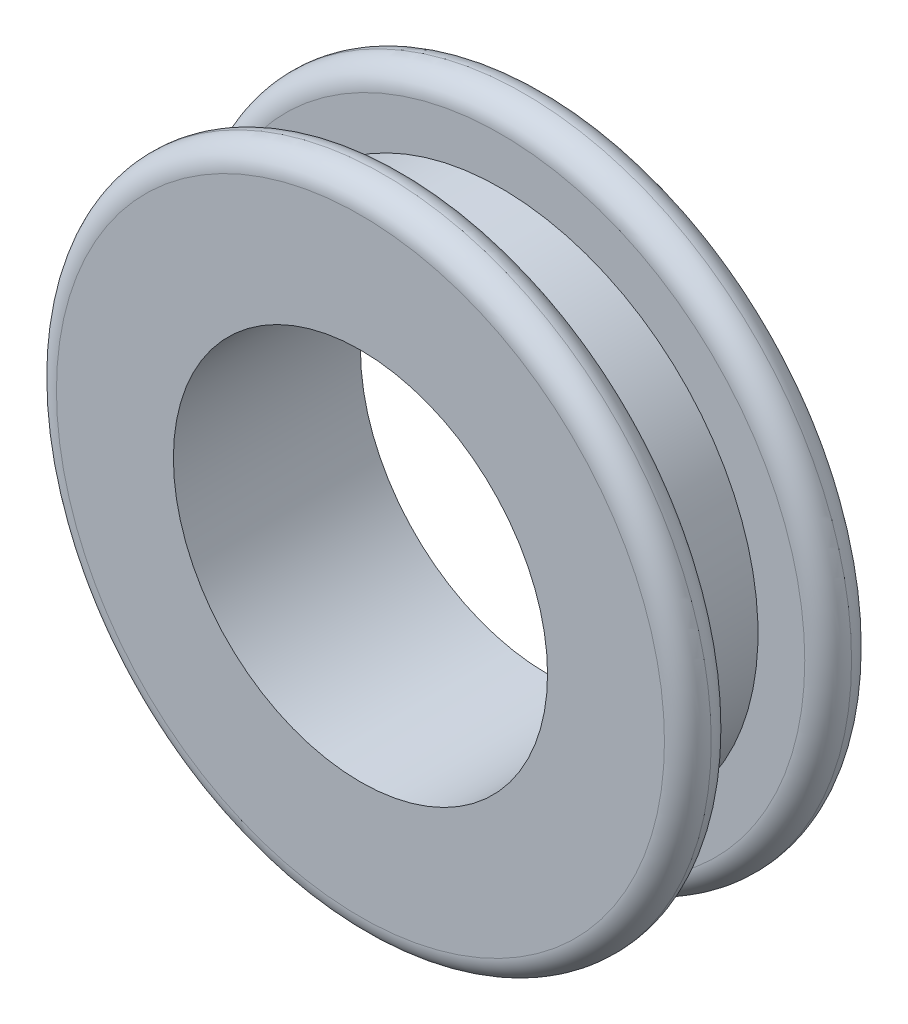
ISO-10303-21;
HEADER;
FILE_DESCRIPTION(('STEP AP214'),'2;1');
FILE_NAME('part.step','',(''),(''),'','','');
FILE_SCHEMA(('AUTOMOTIVE_DESIGN { 1 0 10303 214 1 1 1 1 }'));
ENDSEC;
DATA;
#1=APPLICATION_CONTEXT('core data for automotive mechanical design processes');
#2=APPLICATION_PROTOCOL_DEFINITION('international standard','automotive_design',2000,#1);
#3=PRODUCT_CONTEXT('',#1,'mechanical');
#4=PRODUCT('Part','Part','',(#3));
#5=PRODUCT_RELATED_PRODUCT_CATEGORY('part','',(#4));
#6=PRODUCT_DEFINITION_FORMATION('','',#4);
#7=PRODUCT_DEFINITION_CONTEXT('part definition',#1,'design');
#8=PRODUCT_DEFINITION('design','',#6,#7);
#9=PRODUCT_DEFINITION_SHAPE('','',#8);
#10=(LENGTH_UNIT() NAMED_UNIT(*) SI_UNIT(.MILLI.,.METRE.));
#11=(NAMED_UNIT(*) PLANE_ANGLE_UNIT() SI_UNIT($,.RADIAN.));
#12=(NAMED_UNIT(*) SI_UNIT($,.STERADIAN.) SOLID_ANGLE_UNIT());
#13=UNCERTAINTY_MEASURE_WITH_UNIT(LENGTH_MEASURE(1.E-05),#10,'distance_accuracy_value','');
#14=(GEOMETRIC_REPRESENTATION_CONTEXT(3) GLOBAL_UNCERTAINTY_ASSIGNED_CONTEXT((#13)) GLOBAL_UNIT_ASSIGNED_CONTEXT((#10,
#11,#12)) REPRESENTATION_CONTEXT('',''));
#15=CARTESIAN_POINT('',(0.,0.,0.));
#16=DIRECTION('',(0.,0.,1.));
#17=DIRECTION('',(1.,0.,0.));
#18=AXIS2_PLACEMENT_3D('',#15,#16,#17);
#19=CARTESIAN_POINT('',(0.,0.,-4.));
#20=DIRECTION('',(0.,0.,-1.));
#21=DIRECTION('',(1.,0.,0.));
#22=AXIS2_PLACEMENT_3D('',#19,#20,#21);
#23=PLANE('',#22);
#24=CARTESIAN_POINT('',(0.,0.,-4.));
#25=DIRECTION('',(0.,0.,1.));
#26=DIRECTION('',(1.,0.,0.));
#27=AXIS2_PLACEMENT_3D('',#24,#25,#26);
#28=CIRCLE('',#27,6.5);
#29=CARTESIAN_POINT('',(6.5,0.,-4.));
#30=VERTEX_POINT('',#29);
#31=EDGE_CURVE('E43',#30,#30,#28,.T.);
#32=ORIENTED_EDGE('',*,*,#31,.F.);
#33=EDGE_LOOP('',(#32));
#34=FACE_BOUND('',#33,.T.);
#35=CARTESIAN_POINT('',(0.,0.,-4.));
#36=DIRECTION('',(0.,0.,1.));
#37=DIRECTION('',(1.,0.,0.));
#38=AXIS2_PLACEMENT_3D('',#35,#36,#37);
#39=CIRCLE('',#38,4.);
#40=CARTESIAN_POINT('',(4.,0.,-4.));
#41=VERTEX_POINT('',#40);
#42=EDGE_CURVE('E74',#41,#41,#39,.T.);
#43=ORIENTED_EDGE('',*,*,#42,.T.);
#44=EDGE_LOOP('',(#43));
#45=FACE_BOUND('',#44,.T.);
#46=ADVANCED_FACE('F35',(#34,#45),#23,.T.);
#47=CARTESIAN_POINT('',(0.,0.,0.));
#48=DIRECTION('',(0.,0.,-1.));
#49=DIRECTION('',(1.,0.,0.));
#50=AXIS2_PLACEMENT_3D('',#47,#48,#49);
#51=PLANE('',#50);
#52=CARTESIAN_POINT('',(0.,0.,0.));
#53=DIRECTION('',(0.,0.,1.));
#54=DIRECTION('',(1.,0.,0.));
#55=AXIS2_PLACEMENT_3D('',#52,#53,#54);
#56=CIRCLE('',#55,6.5);
#57=CARTESIAN_POINT('',(6.5,0.,0.));
#58=VERTEX_POINT('',#57);
#59=EDGE_CURVE('E48',#58,#58,#56,.F.);
#60=ORIENTED_EDGE('',*,*,#59,.F.);
#61=EDGE_LOOP('',(#60));
#62=FACE_BOUND('',#61,.T.);
#63=CARTESIAN_POINT('',(0.,0.,0.));
#64=DIRECTION('',(0.,0.,1.));
#65=DIRECTION('',(1.,0.,0.));
#66=AXIS2_PLACEMENT_3D('',#63,#64,#65);
#67=CIRCLE('',#66,4.);
#68=CARTESIAN_POINT('',(4.,0.,0.));
#69=VERTEX_POINT('',#68);
#70=EDGE_CURVE('E77',#69,#69,#67,.T.);
#71=ORIENTED_EDGE('',*,*,#70,.F.);
#72=EDGE_LOOP('',(#71));
#73=FACE_BOUND('',#72,.T.);
#74=ADVANCED_FACE('F70',(#62,#73),#51,.F.);
#75=CARTESIAN_POINT('',(0.,0.,-4.));
#76=DIRECTION('',(0.,0.,1.));
#77=DIRECTION('',(-1.,0.,0.));
#78=AXIS2_PLACEMENT_3D('',#75,#76,#77);
#79=CYLINDRICAL_SURFACE('',#78,4.);
#80=ORIENTED_EDGE('',*,*,#42,.F.);
#81=EDGE_LOOP('',(#80));
#82=FACE_BOUND('',#81,.T.);
#83=ORIENTED_EDGE('',*,*,#70,.T.);
#84=EDGE_LOOP('',(#83));
#85=FACE_BOUND('',#84,.T.);
#86=ADVANCED_FACE('F91',(#82,#85),#79,.F.);
#87=CARTESIAN_POINT('',(0.,7.,-3.));
#88=DIRECTION('',(0.,0.,-1.));
#89=DIRECTION('',(1.,0.,0.));
#90=AXIS2_PLACEMENT_3D('',#87,#88,#89);
#91=PLANE('',#90);
#92=CARTESIAN_POINT('',(0.,0.,-3.));
#93=DIRECTION('',(0.,0.,1.));
#94=DIRECTION('',(1.,0.,0.));
#95=AXIS2_PLACEMENT_3D('',#92,#93,#94);
#96=CIRCLE('',#95,6.5);
#97=CARTESIAN_POINT('',(6.5,0.,-3.));
#98=VERTEX_POINT('',#97);
#99=EDGE_CURVE('E10',#98,#98,#96,.F.);
#100=ORIENTED_EDGE('',*,*,#99,.F.);
#101=EDGE_LOOP('',(#100));
#102=FACE_BOUND('',#101,.T.);
#103=CARTESIAN_POINT('',(0.,0.,-3.));
#104=DIRECTION('',(0.,0.,-1.));
#105=DIRECTION('',(-1.,0.,0.));
#106=AXIS2_PLACEMENT_3D('',#103,#104,#105);
#107=CIRCLE('',#106,5.5);
#108=CARTESIAN_POINT('',(-5.5,0.,-3.));
#109=VERTEX_POINT('',#108);
#110=EDGE_CURVE('E57',#109,#109,#107,.T.);
#111=ORIENTED_EDGE('',*,*,#110,.T.);
#112=EDGE_LOOP('',(#111));
#113=FACE_BOUND('',#112,.T.);
#114=ADVANCED_FACE('F96',(#102,#113),#91,.F.);
#115=CARTESIAN_POINT('',(0.,0.,1.51087421062077));
#116=DIRECTION('',(0.,0.,1.));
#117=DIRECTION('',(-1.,0.,0.));
#118=AXIS2_PLACEMENT_3D('',#115,#116,#117);
#119=CYLINDRICAL_SURFACE('',#118,5.5);
#120=CARTESIAN_POINT('',(0.,0.,-1.));
#121=DIRECTION('',(0.,0.,-1.));
#122=DIRECTION('',(-1.,0.,0.));
#123=AXIS2_PLACEMENT_3D('',#120,#121,#122);
#124=CIRCLE('',#123,5.5);
#125=CARTESIAN_POINT('',(-5.5,0.,-1.));
#126=VERTEX_POINT('',#125);
#127=EDGE_CURVE('E53',#126,#126,#124,.T.);
#128=ORIENTED_EDGE('',*,*,#127,.T.);
#129=EDGE_LOOP('',(#128));
#130=FACE_BOUND('',#129,.T.);
#131=ORIENTED_EDGE('',*,*,#110,.F.);
#132=EDGE_LOOP('',(#131));
#133=FACE_BOUND('',#132,.T.);
#134=ADVANCED_FACE('F101',(#130,#133),#119,.T.);
#135=CARTESIAN_POINT('',(0.,7.,-1.));
#136=DIRECTION('',(0.,0.,1.));
#137=DIRECTION('',(-1.,0.,0.));
#138=AXIS2_PLACEMENT_3D('',#135,#136,#137);
#139=PLANE('',#138);
#140=CARTESIAN_POINT('',(0.,0.,-1.));
#141=DIRECTION('',(0.,0.,-1.));
#142=DIRECTION('',(-1.,0.,0.));
#143=AXIS2_PLACEMENT_3D('',#140,#141,#142);
#144=CIRCLE('',#143,6.5);
#145=CARTESIAN_POINT('',(-6.5,0.,-1.));
#146=VERTEX_POINT('',#145);
#147=EDGE_CURVE('E76',#146,#146,#144,.F.);
#148=ORIENTED_EDGE('',*,*,#147,.F.);
#149=EDGE_LOOP('',(#148));
#150=FACE_BOUND('',#149,.T.);
#151=ORIENTED_EDGE('',*,*,#127,.F.);
#152=EDGE_LOOP('',(#151));
#153=FACE_BOUND('',#152,.T.);
#154=ADVANCED_FACE('F111',(#150,#153),#139,.F.);
#155=CARTESIAN_POINT('',(0.,0.,-0.5));
#156=DIRECTION('',(0.,0.,-1.));
#157=DIRECTION('',(1.,0.,0.));
#158=AXIS2_PLACEMENT_3D('',#155,#156,#157);
#159=TOROIDAL_SURFACE('',#158,6.5,0.5);
#160=ORIENTED_EDGE('',*,*,#59,.T.);
#161=EDGE_LOOP('',(#160));
#162=FACE_BOUND('',#161,.T.);
#163=CARTESIAN_POINT('',(0.,0.,-0.5));
#164=DIRECTION('',(0.,0.,1.));
#165=DIRECTION('',(1.,0.,0.));
#166=AXIS2_PLACEMENT_3D('',#163,#164,#165);
#167=CIRCLE('',#166,7.);
#168=CARTESIAN_POINT('',(7.,0.,-0.5));
#169=VERTEX_POINT('',#168);
#170=EDGE_CURVE('E51',#169,#169,#167,.T.);
#171=ORIENTED_EDGE('',*,*,#170,.T.);
#172=EDGE_LOOP('',(#171));
#173=FACE_BOUND('',#172,.T.);
#174=ADVANCED_FACE('F87',(#162,#173),#159,.T.);
#175=CARTESIAN_POINT('',(0.,0.,-0.5));
#176=DIRECTION('',(0.,0.,1.));
#177=DIRECTION('',(-1.,0.,0.));
#178=AXIS2_PLACEMENT_3D('',#175,#176,#177);
#179=TOROIDAL_SURFACE('',#178,6.5,0.5);
#180=ORIENTED_EDGE('',*,*,#147,.T.);
#181=EDGE_LOOP('',(#180));
#182=FACE_BOUND('',#181,.T.);
#183=ORIENTED_EDGE('',*,*,#170,.F.);
#184=EDGE_LOOP('',(#183));
#185=FACE_BOUND('',#184,.T.);
#186=ADVANCED_FACE('F106',(#182,#185),#179,.T.);
#187=CARTESIAN_POINT('',(0.,0.,-3.5));
#188=DIRECTION('',(0.,0.,-1.));
#189=DIRECTION('',(1.,0.,0.));
#190=AXIS2_PLACEMENT_3D('',#187,#188,#189);
#191=TOROIDAL_SURFACE('',#190,6.5,0.5);
#192=ORIENTED_EDGE('',*,*,#99,.T.);
#193=EDGE_LOOP('',(#192));
#194=FACE_BOUND('',#193,.T.);
#195=CARTESIAN_POINT('',(0.,0.,-3.5));
#196=DIRECTION('',(0.,0.,1.));
#197=DIRECTION('',(1.,0.,0.));
#198=AXIS2_PLACEMENT_3D('',#195,#196,#197);
#199=CIRCLE('',#198,7.);
#200=CARTESIAN_POINT('',(7.,0.,-3.5));
#201=VERTEX_POINT('',#200);
#202=EDGE_CURVE('E39',#201,#201,#199,.T.);
#203=ORIENTED_EDGE('',*,*,#202,.T.);
#204=EDGE_LOOP('',(#203));
#205=FACE_BOUND('',#204,.T.);
#206=ADVANCED_FACE('F37',(#194,#205),#191,.T.);
#207=CARTESIAN_POINT('',(0.,0.,-3.5));
#208=DIRECTION('',(0.,0.,-1.));
#209=DIRECTION('',(1.,0.,0.));
#210=AXIS2_PLACEMENT_3D('',#207,#208,#209);
#211=TOROIDAL_SURFACE('',#210,6.5,0.5);
#212=ORIENTED_EDGE('',*,*,#202,.F.);
#213=EDGE_LOOP('',(#212));
#214=FACE_BOUND('',#213,.T.);
#215=ORIENTED_EDGE('',*,*,#31,.T.);
#216=EDGE_LOOP('',(#215));
#217=FACE_BOUND('',#216,.T.);
#218=ADVANCED_FACE('F63',(#214,#217),#211,.T.);
#219=CLOSED_SHELL('',(#46,#74,#86,#114,#134,#154,#174,#186,#206,#218));
#220=MANIFOLD_SOLID_BREP('B2',#219);
#221=ADVANCED_BREP_SHAPE_REPRESENTATION('',(#18,#220),#14);
#222=SHAPE_DEFINITION_REPRESENTATION(#9,#221);
ENDSEC;
END-ISO-10303-21;
